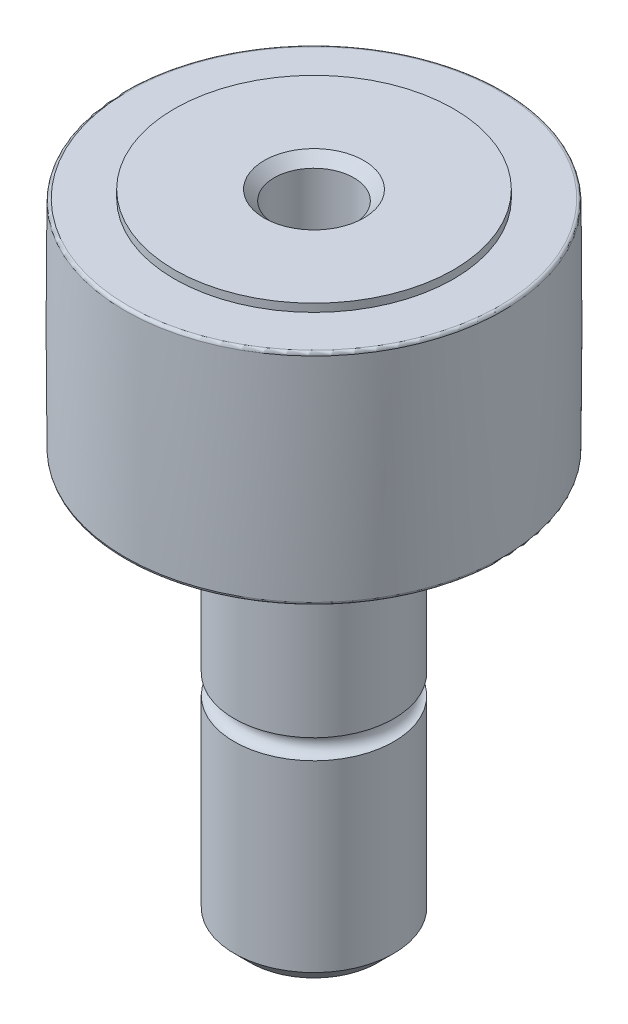
ISO-10303-21;
HEADER;
FILE_DESCRIPTION(('STEP AP214'),'2;1');
FILE_NAME('part.step','',(''),(''),'','','');
FILE_SCHEMA(('AUTOMOTIVE_DESIGN { 1 0 10303 214 1 1 1 1 }'));
ENDSEC;
DATA;
#1=APPLICATION_CONTEXT('core data for automotive mechanical design processes');
#2=APPLICATION_PROTOCOL_DEFINITION('international standard','automotive_design',2000,#1);
#3=PRODUCT_CONTEXT('',#1,'mechanical');
#4=PRODUCT('Part','Part','',(#3));
#5=PRODUCT_RELATED_PRODUCT_CATEGORY('part','',(#4));
#6=PRODUCT_DEFINITION_FORMATION('','',#4);
#7=PRODUCT_DEFINITION_CONTEXT('part definition',#1,'design');
#8=PRODUCT_DEFINITION('design','',#6,#7);
#9=PRODUCT_DEFINITION_SHAPE('','',#8);
#10=(LENGTH_UNIT() NAMED_UNIT(*) SI_UNIT(.MILLI.,.METRE.));
#11=(NAMED_UNIT(*) PLANE_ANGLE_UNIT() SI_UNIT($,.RADIAN.));
#12=(NAMED_UNIT(*) SI_UNIT($,.STERADIAN.) SOLID_ANGLE_UNIT());
#13=UNCERTAINTY_MEASURE_WITH_UNIT(LENGTH_MEASURE(1.E-05),#10,'distance_accuracy_value','');
#14=(GEOMETRIC_REPRESENTATION_CONTEXT(3) GLOBAL_UNCERTAINTY_ASSIGNED_CONTEXT((#13)) GLOBAL_UNIT_ASSIGNED_CONTEXT((#10,
#11,#12)) REPRESENTATION_CONTEXT('',''));
#15=CARTESIAN_POINT('',(0.,0.,0.));
#16=DIRECTION('',(0.,0.,1.));
#17=DIRECTION('',(1.,0.,0.));
#18=AXIS2_PLACEMENT_3D('',#15,#16,#17);
#19=CARTESIAN_POINT('',(0.,0.,0.));
#20=DIRECTION('',(0.,-1.,0.));
#21=DIRECTION('',(0.,0.,-1.));
#22=AXIS2_PLACEMENT_3D('',#19,#20,#21);
#23=PLANE('',#22);
#24=CARTESIAN_POINT('',(0.,0.,0.));
#25=DIRECTION('',(0.,-1.,0.));
#26=DIRECTION('',(0.,0.,-1.));
#27=AXIS2_PLACEMENT_3D('',#24,#25,#26);
#28=CIRCLE('',#27,3.19999999999999);
#29=CARTESIAN_POINT('',(0.,0.,-3.19999999999999));
#30=VERTEX_POINT('',#29);
#31=EDGE_CURVE('E81',#30,#30,#28,.T.);
#32=ORIENTED_EDGE('',*,*,#31,.T.);
#33=EDGE_LOOP('',(#32));
#34=FACE_BOUND('',#33,.T.);
#35=ADVANCED_FACE('F34',(#34),#23,.T.);
#36=CARTESIAN_POINT('',(0.,-6.89025893958077,0.));
#37=DIRECTION('',(0.,-1.,0.));
#38=DIRECTION('',(0.,0.,-1.));
#39=AXIS2_PLACEMENT_3D('',#36,#37,#38);
#40=CYLINDRICAL_SURFACE('',#39,4.);
#41=CARTESIAN_POINT('',(0.,0.800000000000009,0.));
#42=DIRECTION('',(0.,-1.,0.));
#43=DIRECTION('',(0.,0.,-1.));
#44=AXIS2_PLACEMENT_3D('',#41,#42,#43);
#45=CIRCLE('',#44,4.);
#46=CARTESIAN_POINT('',(0.,0.800000000000009,-4.));
#47=VERTEX_POINT('',#46);
#48=EDGE_CURVE('E85',#47,#47,#45,.F.);
#49=ORIENTED_EDGE('',*,*,#48,.T.);
#50=EDGE_LOOP('',(#49));
#51=FACE_BOUND('',#50,.T.);
#52=CARTESIAN_POINT('',(0.,9.99999999999999,0.));
#53=DIRECTION('',(0.,-1.,0.));
#54=DIRECTION('',(0.,0.,-1.));
#55=AXIS2_PLACEMENT_3D('',#52,#53,#54);
#56=CIRCLE('',#55,4.);
#57=CARTESIAN_POINT('',(0.,9.99999999999999,-4.));
#58=VERTEX_POINT('',#57);
#59=EDGE_CURVE('E78',#58,#58,#56,.T.);
#60=ORIENTED_EDGE('',*,*,#59,.T.);
#61=EDGE_LOOP('',(#60));
#62=FACE_BOUND('',#61,.T.);
#63=ADVANCED_FACE('F118',(#51,#62),#40,.T.);
#64=CARTESIAN_POINT('',(0.,10.5,0.));
#65=DIRECTION('',(0.,-1.,0.));
#66=DIRECTION('',(0.,0.,-1.));
#67=AXIS2_PLACEMENT_3D('',#64,#65,#66);
#68=TOROIDAL_SURFACE('',#67,4.,0.5);
#69=CARTESIAN_POINT('',(0.,11.,0.));
#70=DIRECTION('',(0.,-1.,0.));
#71=DIRECTION('',(0.,0.,-1.));
#72=AXIS2_PLACEMENT_3D('',#69,#70,#71);
#73=CIRCLE('',#72,4.);
#74=CARTESIAN_POINT('',(0.,11.,-4.));
#75=VERTEX_POINT('',#74);
#76=EDGE_CURVE('E75',#75,#75,#73,.T.);
#77=ORIENTED_EDGE('',*,*,#76,.T.);
#78=EDGE_LOOP('',(#77));
#79=FACE_BOUND('',#78,.T.);
#80=ORIENTED_EDGE('',*,*,#59,.F.);
#81=EDGE_LOOP('',(#80));
#82=FACE_BOUND('',#81,.T.);
#83=ADVANCED_FACE('F123',(#79,#82),#68,.F.);
#84=CARTESIAN_POINT('',(0.,-6.89025893958077,0.));
#85=DIRECTION('',(0.,-1.,0.));
#86=DIRECTION('',(0.,0.,-1.));
#87=AXIS2_PLACEMENT_3D('',#84,#85,#86);
#88=CYLINDRICAL_SURFACE('',#87,4.);
#89=CARTESIAN_POINT('',(0.,20.,0.));
#90=DIRECTION('',(0.,-1.,0.));
#91=DIRECTION('',(0.,0.,-1.));
#92=AXIS2_PLACEMENT_3D('',#89,#90,#91);
#93=CIRCLE('',#92,4.);
#94=CARTESIAN_POINT('',(0.,20.,-4.));
#95=VERTEX_POINT('',#94);
#96=EDGE_CURVE('E72',#95,#95,#93,.T.);
#97=ORIENTED_EDGE('',*,*,#96,.T.);
#98=EDGE_LOOP('',(#97));
#99=FACE_BOUND('',#98,.T.);
#100=ORIENTED_EDGE('',*,*,#76,.F.);
#101=EDGE_LOOP('',(#100));
#102=FACE_BOUND('',#101,.T.);
#103=ADVANCED_FACE('F167',(#99,#102),#88,.T.);
#104=CARTESIAN_POINT('',(4.,20.,0.));
#105=DIRECTION('',(0.,-1.,0.));
#106=DIRECTION('',(0.,0.,-1.));
#107=AXIS2_PLACEMENT_3D('',#104,#105,#106);
#108=PLANE('',#107);
#109=CARTESIAN_POINT('',(0.,20.,0.));
#110=DIRECTION('',(0.,-1.,0.));
#111=DIRECTION('',(0.,0.,-1.));
#112=AXIS2_PLACEMENT_3D('',#109,#110,#111);
#113=CIRCLE('',#112,7.00000000000001);
#114=CARTESIAN_POINT('',(0.,20.,-7.00000000000001));
#115=VERTEX_POINT('',#114);
#116=EDGE_CURVE('E69',#115,#115,#113,.T.);
#117=ORIENTED_EDGE('',*,*,#116,.T.);
#118=EDGE_LOOP('',(#117));
#119=FACE_BOUND('',#118,.T.);
#120=ORIENTED_EDGE('',*,*,#96,.F.);
#121=EDGE_LOOP('',(#120));
#122=FACE_BOUND('',#121,.T.);
#123=ADVANCED_FACE('F163',(#119,#122),#108,.T.);
#124=CARTESIAN_POINT('',(0.,-6.89025893958077,0.));
#125=DIRECTION('',(0.,-1.,0.));
#126=DIRECTION('',(0.,0.,-1.));
#127=AXIS2_PLACEMENT_3D('',#124,#125,#126);
#128=CYLINDRICAL_SURFACE('',#127,7.00000000000001);
#129=CARTESIAN_POINT('',(0.,20.6,0.));
#130=DIRECTION('',(0.,-1.,0.));
#131=DIRECTION('',(0.,0.,-1.));
#132=AXIS2_PLACEMENT_3D('',#129,#130,#131);
#133=CIRCLE('',#132,7.00000000000001);
#134=CARTESIAN_POINT('',(0.,20.6,-7.00000000000001));
#135=VERTEX_POINT('',#134);
#136=EDGE_CURVE('E66',#135,#135,#133,.T.);
#137=ORIENTED_EDGE('',*,*,#136,.T.);
#138=EDGE_LOOP('',(#137));
#139=FACE_BOUND('',#138,.T.);
#140=ORIENTED_EDGE('',*,*,#116,.F.);
#141=EDGE_LOOP('',(#140));
#142=FACE_BOUND('',#141,.T.);
#143=ADVANCED_FACE('F159',(#139,#142),#128,.T.);
#144=CARTESIAN_POINT('',(7.00000000000001,20.6,0.));
#145=DIRECTION('',(0.,-1.,0.));
#146=DIRECTION('',(0.,0.,-1.));
#147=AXIS2_PLACEMENT_3D('',#144,#145,#146);
#148=PLANE('',#147);
#149=CARTESIAN_POINT('',(0.,20.6,0.));
#150=DIRECTION('',(0.,-1.,0.));
#151=DIRECTION('',(0.,0.,-1.));
#152=AXIS2_PLACEMENT_3D('',#149,#150,#151);
#153=CIRCLE('',#152,9.32136809064099);
#154=CARTESIAN_POINT('',(0.,20.6,-9.32136809064099));
#155=VERTEX_POINT('',#154);
#156=EDGE_CURVE('E98',#155,#155,#153,.T.);
#157=ORIENTED_EDGE('',*,*,#156,.T.);
#158=EDGE_LOOP('',(#157));
#159=FACE_BOUND('',#158,.T.);
#160=ORIENTED_EDGE('',*,*,#136,.F.);
#161=EDGE_LOOP('',(#160));
#162=FACE_BOUND('',#161,.T.);
#163=ADVANCED_FACE('F155',(#159,#162),#148,.T.);
#164=CARTESIAN_POINT('',(0.,26.1,0.));
#165=DIRECTION('',(0.,-1.,0.));
#166=DIRECTION('',(0.,0.,-1.));
#167=AXIS2_PLACEMENT_3D('',#164,#165,#166);
#168=DEGENERATE_TOROIDAL_SURFACE('',#167,490.5,500.,.F.);
#169=CARTESIAN_POINT('',(0.,31.451605481644,0.));
#170=DIRECTION('',(0.,-1.,0.));
#171=DIRECTION('',(0.,0.,-1.));
#172=AXIS2_PLACEMENT_3D('',#169,#170,#171);
#173=CIRCLE('',#172,9.47135949849051);
#174=CARTESIAN_POINT('',(0.,31.451605481644,-9.47135949849051));
#175=VERTEX_POINT('',#174);
#176=EDGE_CURVE('E92',#175,#175,#173,.T.);
#177=ORIENTED_EDGE('',*,*,#176,.T.);
#178=EDGE_LOOP('',(#177));
#179=FACE_BOUND('',#178,.T.);
#180=CARTESIAN_POINT('',(0.,20.7483945183555,0.));
#181=DIRECTION('',(0.,1.,0.));
#182=DIRECTION('',(0.,0.,1.));
#183=AXIS2_PLACEMENT_3D('',#180,#181,#182);
#184=CIRCLE('',#183,9.47135949849051);
#185=CARTESIAN_POINT('',(0.,20.7483945183555,9.47135949849051));
#186=VERTEX_POINT('',#185);
#187=EDGE_CURVE('E88',#186,#186,#184,.T.);
#188=ORIENTED_EDGE('',*,*,#187,.T.);
#189=EDGE_LOOP('',(#188));
#190=FACE_BOUND('',#189,.T.);
#191=ADVANCED_FACE('F151',(#179,#190),#168,.F.);
#192=CARTESIAN_POINT('',(9.46974908488219,31.5999999999995,0.));
#193=DIRECTION('',(0.,1.,0.));
#194=DIRECTION('',(0.,0.,1.));
#195=AXIS2_PLACEMENT_3D('',#192,#193,#194);
#196=PLANE('',#195);
#197=CARTESIAN_POINT('',(0.,31.5999999999995,0.));
#198=DIRECTION('',(0.,1.,0.));
#199=DIRECTION('',(0.,0.,1.));
#200=AXIS2_PLACEMENT_3D('',#197,#198,#199);
#201=CIRCLE('',#200,9.32136809064099);
#202=CARTESIAN_POINT('',(0.,31.5999999999995,9.32136809064099));
#203=VERTEX_POINT('',#202);
#204=EDGE_CURVE('E95',#203,#203,#201,.T.);
#205=ORIENTED_EDGE('',*,*,#204,.T.);
#206=EDGE_LOOP('',(#205));
#207=FACE_BOUND('',#206,.T.);
#208=CARTESIAN_POINT('',(0.,31.6,0.));
#209=DIRECTION('',(0.,-1.,0.));
#210=DIRECTION('',(0.,0.,-1.));
#211=AXIS2_PLACEMENT_3D('',#208,#209,#210);
#212=CIRCLE('',#211,7.00000000000001);
#213=CARTESIAN_POINT('',(0.,31.6,-7.00000000000001));
#214=VERTEX_POINT('',#213);
#215=EDGE_CURVE('E57',#214,#214,#212,.T.);
#216=ORIENTED_EDGE('',*,*,#215,.T.);
#217=EDGE_LOOP('',(#216));
#218=FACE_BOUND('',#217,.T.);
#219=ADVANCED_FACE('F147',(#207,#218),#196,.T.);
#220=CARTESIAN_POINT('',(0.,-6.89025893958077,0.));
#221=DIRECTION('',(0.,-1.,0.));
#222=DIRECTION('',(0.,0.,-1.));
#223=AXIS2_PLACEMENT_3D('',#220,#221,#222);
#224=CYLINDRICAL_SURFACE('',#223,7.00000000000001);
#225=CARTESIAN_POINT('',(0.,32.,0.));
#226=DIRECTION('',(0.,-1.,0.));
#227=DIRECTION('',(0.,0.,-1.));
#228=AXIS2_PLACEMENT_3D('',#225,#226,#227);
#229=CIRCLE('',#228,7.00000000000001);
#230=CARTESIAN_POINT('',(0.,32.,-7.00000000000001));
#231=VERTEX_POINT('',#230);
#232=EDGE_CURVE('E53',#231,#231,#229,.T.);
#233=ORIENTED_EDGE('',*,*,#232,.T.);
#234=EDGE_LOOP('',(#233));
#235=FACE_BOUND('',#234,.T.);
#236=ORIENTED_EDGE('',*,*,#215,.F.);
#237=EDGE_LOOP('',(#236));
#238=FACE_BOUND('',#237,.T.);
#239=ADVANCED_FACE('F139',(#235,#238),#224,.T.);
#240=CARTESIAN_POINT('',(7.00000000000001,32.,0.));
#241=DIRECTION('',(0.,1.,0.));
#242=DIRECTION('',(0.,0.,1.));
#243=AXIS2_PLACEMENT_3D('',#240,#241,#242);
#244=PLANE('',#243);
#245=CARTESIAN_POINT('',(0.,32.,0.));
#246=DIRECTION('',(0.,1.,0.));
#247=DIRECTION('',(0.,0.,1.));
#248=AXIS2_PLACEMENT_3D('',#245,#246,#247);
#249=CIRCLE('',#248,2.5);
#250=CARTESIAN_POINT('',(0.,32.,2.5));
#251=VERTEX_POINT('',#250);
#252=EDGE_CURVE('E11',#251,#251,#249,.F.);
#253=ORIENTED_EDGE('',*,*,#252,.T.);
#254=EDGE_LOOP('',(#253));
#255=FACE_BOUND('',#254,.T.);
#256=ORIENTED_EDGE('',*,*,#232,.F.);
#257=EDGE_LOOP('',(#256));
#258=FACE_BOUND('',#257,.T.);
#259=ADVANCED_FACE('F130',(#255,#258),#244,.T.);
#260=CARTESIAN_POINT('',(0.,0.,0.));
#261=DIRECTION('',(0.,1.,0.));
#262=DIRECTION('',(0.,0.,1.));
#263=AXIS2_PLACEMENT_3D('',#260,#261,#262);
#264=CONICAL_SURFACE('',#263,3.19999999999999,0.785398163397454);
#265=ORIENTED_EDGE('',*,*,#48,.F.);
#266=EDGE_LOOP('',(#265));
#267=FACE_BOUND('',#266,.T.);
#268=ORIENTED_EDGE('',*,*,#31,.F.);
#269=EDGE_LOOP('',(#268));
#270=FACE_BOUND('',#269,.T.);
#271=ADVANCED_FACE('F127',(#267,#270),#264,.T.);
#272=CARTESIAN_POINT('',(0.,26.,0.));
#273=DIRECTION('',(0.,1.,0.));
#274=DIRECTION('',(0.,0.,1.));
#275=AXIS2_PLACEMENT_3D('',#272,#273,#274);
#276=CONICAL_SURFACE('',#275,2.,1.0471975511966);
#277=CARTESIAN_POINT('',(0.,26.,0.));
#278=DIRECTION('',(0.,1.,0.));
#279=DIRECTION('',(0.,0.,1.));
#280=AXIS2_PLACEMENT_3D('',#277,#278,#279);
#281=CIRCLE('',#280,2.);
#282=CARTESIAN_POINT('',(0.,26.,2.));
#283=VERTEX_POINT('',#282);
#284=EDGE_CURVE('E60',#283,#283,#281,.T.);
#285=ORIENTED_EDGE('',*,*,#284,.T.);
#286=EDGE_LOOP('',(#285));
#287=FACE_BOUND('',#286,.T.);
#288=CARTESIAN_POINT('',(0.,25.7113248654052,0.));
#289=DIRECTION('',(0.,1.,0.));
#290=DIRECTION('',(0.,0.,1.));
#291=AXIS2_PLACEMENT_3D('',#288,#289,#290);
#292=CIRCLE('',#291,1.5);
#293=CARTESIAN_POINT('',(0.,25.7113248654052,1.5));
#294=VERTEX_POINT('',#293);
#295=EDGE_CURVE('E54',#294,#294,#292,.T.);
#296=ORIENTED_EDGE('',*,*,#295,.F.);
#297=EDGE_LOOP('',(#296));
#298=FACE_BOUND('',#297,.T.);
#299=ADVANCED_FACE('F129',(#287,#298),#276,.F.);
#300=CARTESIAN_POINT('',(0.,32.,0.));
#301=DIRECTION('',(0.,1.,0.));
#302=DIRECTION('',(0.,0.,1.));
#303=AXIS2_PLACEMENT_3D('',#300,#301,#302);
#304=CYLINDRICAL_SURFACE('',#303,2.);
#305=CARTESIAN_POINT('',(0.,31.5,0.));
#306=DIRECTION('',(0.,1.,0.));
#307=DIRECTION('',(0.,0.,1.));
#308=AXIS2_PLACEMENT_3D('',#305,#306,#307);
#309=CIRCLE('',#308,2.);
#310=CARTESIAN_POINT('',(0.,31.5,2.));
#311=VERTEX_POINT('',#310);
#312=EDGE_CURVE('E40',#311,#311,#309,.T.);
#313=ORIENTED_EDGE('',*,*,#312,.T.);
#314=EDGE_LOOP('',(#313));
#315=FACE_BOUND('',#314,.T.);
#316=ORIENTED_EDGE('',*,*,#284,.F.);
#317=EDGE_LOOP('',(#316));
#318=FACE_BOUND('',#317,.T.);
#319=ADVANCED_FACE('F47',(#315,#318),#304,.F.);
#320=CARTESIAN_POINT('',(0.,22.,0.));
#321=DIRECTION('',(0.,1.,0.));
#322=DIRECTION('',(0.,0.,1.));
#323=AXIS2_PLACEMENT_3D('',#320,#321,#322);
#324=CONICAL_SURFACE('',#323,1.5,1.0471975511966);
#325=CARTESIAN_POINT('',(0.,21.1339745962156,0.));
#326=VERTEX_POINT('',#325);
#327=VERTEX_LOOP('',#326);
#328=FACE_BOUND('',#327,.T.);
#329=CARTESIAN_POINT('',(0.,22.,0.));
#330=DIRECTION('',(0.,1.,0.));
#331=DIRECTION('',(0.,0.,1.));
#332=AXIS2_PLACEMENT_3D('',#329,#330,#331);
#333=CIRCLE('',#332,1.5);
#334=CARTESIAN_POINT('',(0.,22.,1.5));
#335=VERTEX_POINT('',#334);
#336=EDGE_CURVE('E51',#335,#335,#333,.T.);
#337=ORIENTED_EDGE('',*,*,#336,.T.);
#338=EDGE_LOOP('',(#337));
#339=FACE_BOUND('',#338,.T.);
#340=ADVANCED_FACE('F43',(#328,#339),#324,.F.);
#341=CARTESIAN_POINT('',(0.,32.,0.));
#342=DIRECTION('',(0.,1.,0.));
#343=DIRECTION('',(0.,0.,1.));
#344=AXIS2_PLACEMENT_3D('',#341,#342,#343);
#345=CYLINDRICAL_SURFACE('',#344,1.5);
#346=ORIENTED_EDGE('',*,*,#295,.T.);
#347=EDGE_LOOP('',(#346));
#348=FACE_BOUND('',#347,.T.);
#349=ORIENTED_EDGE('',*,*,#336,.F.);
#350=EDGE_LOOP('',(#349));
#351=FACE_BOUND('',#350,.T.);
#352=ADVANCED_FACE('F46',(#348,#351),#345,.F.);
#353=CARTESIAN_POINT('',(0.,31.4499999999995,0.));
#354=DIRECTION('',(0.,1.,0.));
#355=DIRECTION('',(0.,0.,1.));
#356=AXIS2_PLACEMENT_3D('',#353,#354,#355);
#357=TOROIDAL_SURFACE('',#356,9.32136809064099,0.15);
#358=ORIENTED_EDGE('',*,*,#204,.F.);
#359=EDGE_LOOP('',(#358));
#360=FACE_BOUND('',#359,.T.);
#361=ORIENTED_EDGE('',*,*,#176,.F.);
#362=EDGE_LOOP('',(#361));
#363=FACE_BOUND('',#362,.T.);
#364=ADVANCED_FACE('F113',(#360,#363),#357,.T.);
#365=CARTESIAN_POINT('',(0.,20.75,0.));
#366=DIRECTION('',(0.,-1.,0.));
#367=DIRECTION('',(0.,0.,-1.));
#368=AXIS2_PLACEMENT_3D('',#365,#366,#367);
#369=TOROIDAL_SURFACE('',#368,9.32136809064099,0.15);
#370=ORIENTED_EDGE('',*,*,#187,.F.);
#371=EDGE_LOOP('',(#370));
#372=FACE_BOUND('',#371,.T.);
#373=ORIENTED_EDGE('',*,*,#156,.F.);
#374=EDGE_LOOP('',(#373));
#375=FACE_BOUND('',#374,.T.);
#376=ADVANCED_FACE('F107',(#372,#375),#369,.T.);
#377=CARTESIAN_POINT('',(0.,31.5,0.));
#378=DIRECTION('',(0.,1.,0.));
#379=DIRECTION('',(0.,0.,1.));
#380=AXIS2_PLACEMENT_3D('',#377,#378,#379);
#381=CONICAL_SURFACE('',#380,2.,0.785398163397445);
#382=ORIENTED_EDGE('',*,*,#252,.F.);
#383=EDGE_LOOP('',(#382));
#384=FACE_BOUND('',#383,.T.);
#385=ORIENTED_EDGE('',*,*,#312,.F.);
#386=EDGE_LOOP('',(#385));
#387=FACE_BOUND('',#386,.T.);
#388=ADVANCED_FACE('F105',(#384,#387),#381,.F.);
#389=CLOSED_SHELL('',(#35,#63,#83,#103,#123,#143,#163,#191,#219,#239,#259,#271,#299,#319,#340,
#352,#364,#376,#388));
#390=MANIFOLD_SOLID_BREP('B2',#389);
#391=ADVANCED_BREP_SHAPE_REPRESENTATION('',(#18,#390),#14);
#392=SHAPE_DEFINITION_REPRESENTATION(#9,#391);
ENDSEC;
END-ISO-10303-21;
